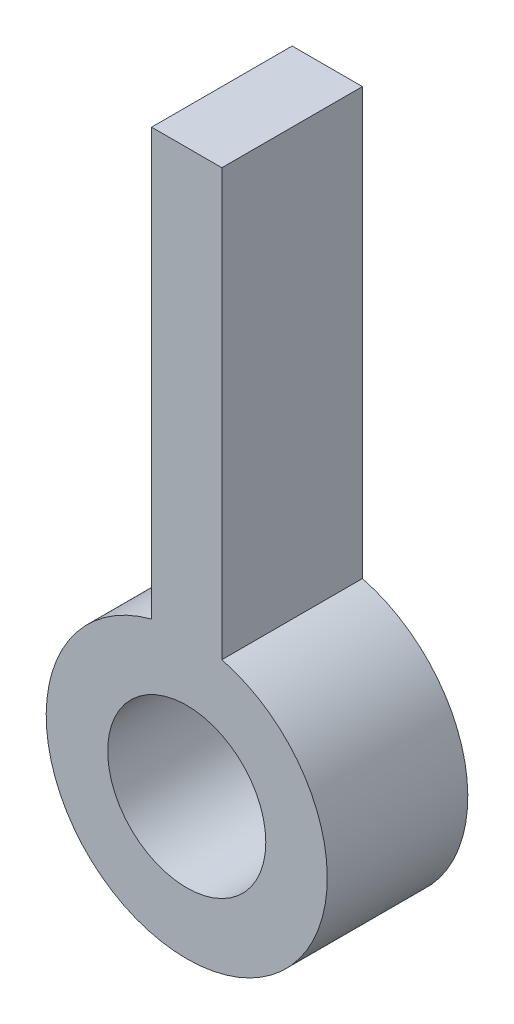
ISO-10303-21;
HEADER;
FILE_DESCRIPTION(('STEP AP214'),'2;1');
FILE_NAME('part.step','',(''),(''),'','','');
FILE_SCHEMA(('AUTOMOTIVE_DESIGN { 1 0 10303 214 1 1 1 1 }'));
ENDSEC;
DATA;
#1=APPLICATION_CONTEXT('core data for automotive mechanical design processes');
#2=APPLICATION_PROTOCOL_DEFINITION('international standard','automotive_design',2000,#1);
#3=PRODUCT_CONTEXT('',#1,'mechanical');
#4=PRODUCT('Part','Part','',(#3));
#5=PRODUCT_RELATED_PRODUCT_CATEGORY('part','',(#4));
#6=PRODUCT_DEFINITION_FORMATION('','',#4);
#7=PRODUCT_DEFINITION_CONTEXT('part definition',#1,'design');
#8=PRODUCT_DEFINITION('design','',#6,#7);
#9=PRODUCT_DEFINITION_SHAPE('','',#8);
#10=(LENGTH_UNIT() NAMED_UNIT(*) SI_UNIT(.MILLI.,.METRE.));
#11=(NAMED_UNIT(*) PLANE_ANGLE_UNIT() SI_UNIT($,.RADIAN.));
#12=(NAMED_UNIT(*) SI_UNIT($,.STERADIAN.) SOLID_ANGLE_UNIT());
#13=UNCERTAINTY_MEASURE_WITH_UNIT(LENGTH_MEASURE(1.E-05),#10,'distance_accuracy_value','');
#14=(GEOMETRIC_REPRESENTATION_CONTEXT(3) GLOBAL_UNCERTAINTY_ASSIGNED_CONTEXT((#13)) GLOBAL_UNIT_ASSIGNED_CONTEXT((#10,
#11,#12)) REPRESENTATION_CONTEXT('',''));
#15=CARTESIAN_POINT('',(0.,0.,0.));
#16=DIRECTION('',(0.,0.,1.));
#17=DIRECTION('',(1.,0.,0.));
#18=AXIS2_PLACEMENT_3D('',#15,#16,#17);
#19=CARTESIAN_POINT('',(0.,0.,4.));
#20=DIRECTION('',(0.,0.,1.));
#21=DIRECTION('',(1.,0.,0.));
#22=AXIS2_PLACEMENT_3D('',#19,#20,#21);
#23=PLANE('',#22);
#24=CARTESIAN_POINT('',(0.,0.,4.));
#25=DIRECTION('',(0.,0.,1.));
#26=DIRECTION('',(1.,0.,0.));
#27=AXIS2_PLACEMENT_3D('',#24,#25,#26);
#28=CIRCLE('',#27,4.);
#29=CARTESIAN_POINT('',(-1.,3.87298334620742,4.));
#30=VERTEX_POINT('',#29);
#31=CARTESIAN_POINT('',(1.,3.87298334620742,4.));
#32=VERTEX_POINT('',#31);
#33=EDGE_CURVE('E104',#30,#32,#28,.T.);
#34=ORIENTED_EDGE('',*,*,#33,.T.);
#35=DIRECTION('',(0.,1.,0.));
#36=VECTOR('',#35,1.);
#37=CARTESIAN_POINT('',(1.,3.87298334620742,4.));
#38=LINE('',#37,#36);
#39=CARTESIAN_POINT('',(1.,16.,4.));
#40=VERTEX_POINT('',#39);
#41=EDGE_CURVE('E99',#32,#40,#38,.T.);
#42=ORIENTED_EDGE('',*,*,#41,.T.);
#43=DIRECTION('',(-1.,0.,0.));
#44=VECTOR('',#43,1.);
#45=CARTESIAN_POINT('',(-1.,16.,4.));
#46=LINE('',#45,#44);
#47=CARTESIAN_POINT('',(-1.,16.,4.));
#48=VERTEX_POINT('',#47);
#49=EDGE_CURVE('E102',#40,#48,#46,.T.);
#50=ORIENTED_EDGE('',*,*,#49,.T.);
#51=DIRECTION('',(0.,-1.,0.));
#52=VECTOR('',#51,1.);
#53=CARTESIAN_POINT('',(-1.,3.87298334620742,4.));
#54=LINE('',#53,#52);
#55=EDGE_CURVE('E69',#48,#30,#54,.T.);
#56=ORIENTED_EDGE('',*,*,#55,.T.);
#57=EDGE_LOOP('',(#34,#42,#50,#56));
#58=FACE_BOUND('',#57,.T.);
#59=CARTESIAN_POINT('',(0.,0.,4.));
#60=DIRECTION('',(0.,0.,1.));
#61=DIRECTION('',(1.,0.,0.));
#62=AXIS2_PLACEMENT_3D('',#59,#60,#61);
#63=CIRCLE('',#62,2.25);
#64=CARTESIAN_POINT('',(2.25,0.,4.));
#65=VERTEX_POINT('',#64);
#66=EDGE_CURVE('E125',#65,#65,#63,.T.);
#67=ORIENTED_EDGE('',*,*,#66,.F.);
#68=EDGE_LOOP('',(#67));
#69=FACE_BOUND('',#68,.T.);
#70=ADVANCED_FACE('F51',(#58,#69),#23,.T.);
#71=CARTESIAN_POINT('',(0.,0.,0.));
#72=DIRECTION('',(0.,0.,1.));
#73=DIRECTION('',(1.,0.,0.));
#74=AXIS2_PLACEMENT_3D('',#71,#72,#73);
#75=PLANE('',#74);
#76=CARTESIAN_POINT('',(0.,0.,0.));
#77=DIRECTION('',(0.,0.,1.));
#78=DIRECTION('',(1.,0.,0.));
#79=AXIS2_PLACEMENT_3D('',#76,#77,#78);
#80=CIRCLE('',#79,4.);
#81=CARTESIAN_POINT('',(-1.,3.87298334620742,0.));
#82=VERTEX_POINT('',#81);
#83=CARTESIAN_POINT('',(1.,3.87298334620742,0.));
#84=VERTEX_POINT('',#83);
#85=EDGE_CURVE('E121',#82,#84,#80,.T.);
#86=ORIENTED_EDGE('',*,*,#85,.F.);
#87=DIRECTION('',(0.,-1.,0.));
#88=VECTOR('',#87,1.);
#89=CARTESIAN_POINT('',(-1.,3.87298334620742,0.));
#90=LINE('',#89,#88);
#91=CARTESIAN_POINT('',(-1.,16.,0.));
#92=VERTEX_POINT('',#91);
#93=EDGE_CURVE('E92',#92,#82,#90,.T.);
#94=ORIENTED_EDGE('',*,*,#93,.F.);
#95=DIRECTION('',(-1.,0.,0.));
#96=VECTOR('',#95,1.);
#97=CARTESIAN_POINT('',(-1.,16.,0.));
#98=LINE('',#97,#96);
#99=CARTESIAN_POINT('',(1.,16.,0.));
#100=VERTEX_POINT('',#99);
#101=EDGE_CURVE('E86',#100,#92,#98,.T.);
#102=ORIENTED_EDGE('',*,*,#101,.F.);
#103=DIRECTION('',(0.,1.,0.));
#104=VECTOR('',#103,1.);
#105=CARTESIAN_POINT('',(1.,3.87298334620742,0.));
#106=LINE('',#105,#104);
#107=EDGE_CURVE('E109',#84,#100,#106,.T.);
#108=ORIENTED_EDGE('',*,*,#107,.F.);
#109=EDGE_LOOP('',(#86,#94,#102,#108));
#110=FACE_BOUND('',#109,.T.);
#111=CARTESIAN_POINT('',(0.,0.,0.));
#112=DIRECTION('',(0.,0.,1.));
#113=DIRECTION('',(1.,0.,0.));
#114=AXIS2_PLACEMENT_3D('',#111,#112,#113);
#115=CIRCLE('',#114,2.25);
#116=CARTESIAN_POINT('',(2.25,0.,0.));
#117=VERTEX_POINT('',#116);
#118=EDGE_CURVE('E145',#117,#117,#115,.T.);
#119=ORIENTED_EDGE('',*,*,#118,.T.);
#120=EDGE_LOOP('',(#119));
#121=FACE_BOUND('',#120,.T.);
#122=ADVANCED_FACE('F139',(#110,#121),#75,.F.);
#123=CARTESIAN_POINT('',(0.,0.,4.));
#124=DIRECTION('',(0.,0.,-1.));
#125=DIRECTION('',(-1.,0.,0.));
#126=AXIS2_PLACEMENT_3D('',#123,#124,#125);
#127=CYLINDRICAL_SURFACE('',#126,4.);
#128=ORIENTED_EDGE('',*,*,#85,.T.);
#129=DIRECTION('',(0.,0.,-1.));
#130=VECTOR('',#129,1.);
#131=CARTESIAN_POINT('',(1.,3.87298334620742,4.));
#132=LINE('',#131,#130);
#133=EDGE_CURVE('E13',#32,#84,#132,.T.);
#134=ORIENTED_EDGE('',*,*,#133,.F.);
#135=ORIENTED_EDGE('',*,*,#33,.F.);
#136=DIRECTION('',(0.,0.,-1.));
#137=VECTOR('',#136,1.);
#138=CARTESIAN_POINT('',(-1.,3.87298334620742,4.));
#139=LINE('',#138,#137);
#140=EDGE_CURVE('E117',#30,#82,#139,.T.);
#141=ORIENTED_EDGE('',*,*,#140,.T.);
#142=EDGE_LOOP('',(#128,#134,#135,#141));
#143=FACE_BOUND('',#142,.T.);
#144=ADVANCED_FACE('F53',(#143),#127,.T.);
#145=CARTESIAN_POINT('',(1.,3.87298334620742,4.));
#146=DIRECTION('',(-1.,0.,0.));
#147=DIRECTION('',(0.,-1.,0.));
#148=AXIS2_PLACEMENT_3D('',#145,#146,#147);
#149=PLANE('',#148);
#150=ORIENTED_EDGE('',*,*,#107,.T.);
#151=DIRECTION('',(0.,0.,-1.));
#152=VECTOR('',#151,1.);
#153=CARTESIAN_POINT('',(1.,16.,4.));
#154=LINE('',#153,#152);
#155=EDGE_CURVE('E61',#40,#100,#154,.T.);
#156=ORIENTED_EDGE('',*,*,#155,.F.);
#157=ORIENTED_EDGE('',*,*,#41,.F.);
#158=ORIENTED_EDGE('',*,*,#133,.T.);
#159=EDGE_LOOP('',(#150,#156,#157,#158));
#160=FACE_BOUND('',#159,.T.);
#161=ADVANCED_FACE('F108',(#160),#149,.F.);
#162=CARTESIAN_POINT('',(-1.,16.,4.));
#163=DIRECTION('',(0.,-1.,0.));
#164=DIRECTION('',(0.,0.,-1.));
#165=AXIS2_PLACEMENT_3D('',#162,#163,#164);
#166=PLANE('',#165);
#167=ORIENTED_EDGE('',*,*,#101,.T.);
#168=DIRECTION('',(0.,0.,-1.));
#169=VECTOR('',#168,1.);
#170=CARTESIAN_POINT('',(-1.,16.,4.));
#171=LINE('',#170,#169);
#172=EDGE_CURVE('E111',#48,#92,#171,.T.);
#173=ORIENTED_EDGE('',*,*,#172,.F.);
#174=ORIENTED_EDGE('',*,*,#49,.F.);
#175=ORIENTED_EDGE('',*,*,#155,.T.);
#176=EDGE_LOOP('',(#167,#173,#174,#175));
#177=FACE_BOUND('',#176,.T.);
#178=ADVANCED_FACE('F112',(#177),#166,.F.);
#179=CARTESIAN_POINT('',(-1.,3.87298334620742,4.));
#180=DIRECTION('',(1.,0.,0.));
#181=DIRECTION('',(0.,1.,0.));
#182=AXIS2_PLACEMENT_3D('',#179,#180,#181);
#183=PLANE('',#182);
#184=ORIENTED_EDGE('',*,*,#93,.T.);
#185=ORIENTED_EDGE('',*,*,#140,.F.);
#186=ORIENTED_EDGE('',*,*,#55,.F.);
#187=ORIENTED_EDGE('',*,*,#172,.T.);
#188=EDGE_LOOP('',(#184,#185,#186,#187));
#189=FACE_BOUND('',#188,.T.);
#190=ADVANCED_FACE('F136',(#189),#183,.F.);
#191=CARTESIAN_POINT('',(0.,0.,4.));
#192=DIRECTION('',(0.,0.,-1.));
#193=DIRECTION('',(-1.,0.,0.));
#194=AXIS2_PLACEMENT_3D('',#191,#192,#193);
#195=CYLINDRICAL_SURFACE('',#194,2.25);
#196=ORIENTED_EDGE('',*,*,#66,.T.);
#197=EDGE_LOOP('',(#196));
#198=FACE_BOUND('',#197,.T.);
#199=ORIENTED_EDGE('',*,*,#118,.F.);
#200=EDGE_LOOP('',(#199));
#201=FACE_BOUND('',#200,.T.);
#202=ADVANCED_FACE('F154',(#198,#201),#195,.F.);
#203=CLOSED_SHELL('',(#70,#122,#144,#161,#178,#190,#202));
#204=MANIFOLD_SOLID_BREP('B2',#203);
#205=ADVANCED_BREP_SHAPE_REPRESENTATION('',(#18,#204),#14);
#206=SHAPE_DEFINITION_REPRESENTATION(#9,#205);
ENDSEC;
END-ISO-10303-21;
